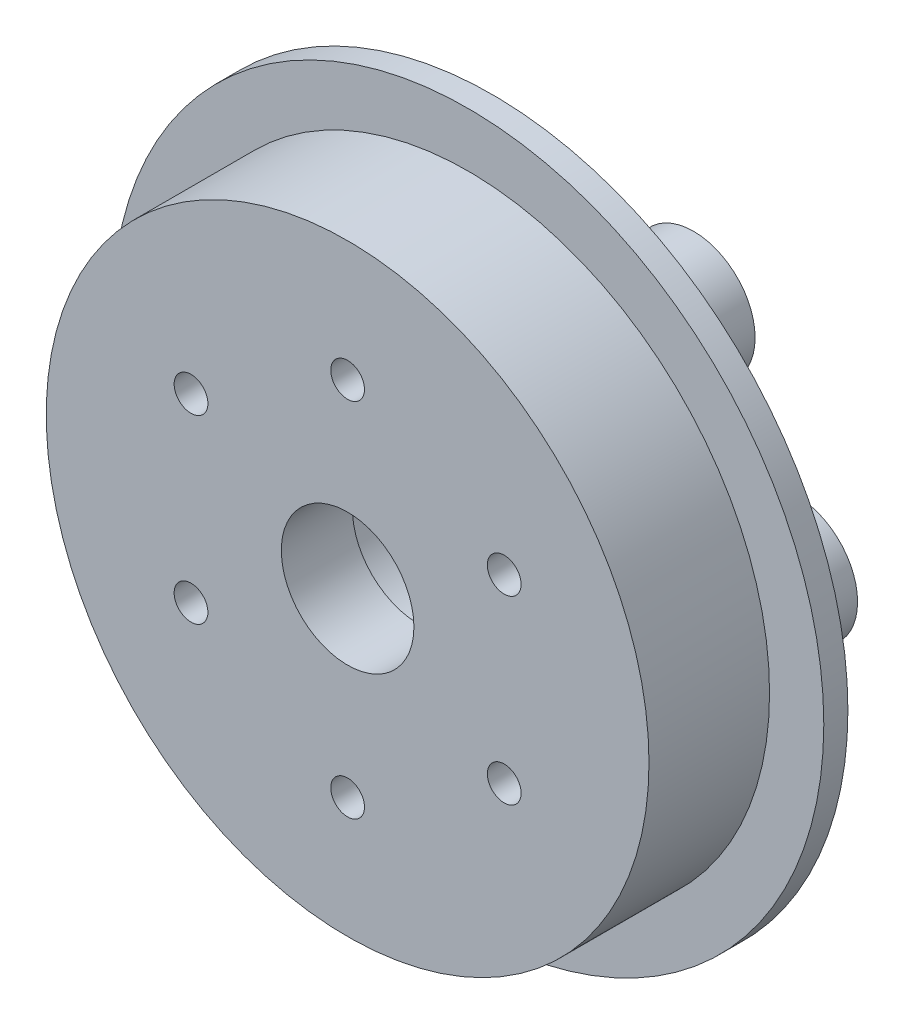
ISO-10303-21;
HEADER;
FILE_DESCRIPTION(('STEP AP214'),'2;1');
FILE_NAME('part.step','',(''),(''),'','','');
FILE_SCHEMA(('AUTOMOTIVE_DESIGN { 1 0 10303 214 1 1 1 1 }'));
ENDSEC;
DATA;
#1=APPLICATION_CONTEXT('core data for automotive mechanical design processes');
#2=APPLICATION_PROTOCOL_DEFINITION('international standard','automotive_design',2000,#1);
#3=PRODUCT_CONTEXT('',#1,'mechanical');
#4=PRODUCT('Part','Part','',(#3));
#5=PRODUCT_RELATED_PRODUCT_CATEGORY('part','',(#4));
#6=PRODUCT_DEFINITION_FORMATION('','',#4);
#7=PRODUCT_DEFINITION_CONTEXT('part definition',#1,'design');
#8=PRODUCT_DEFINITION('design','',#6,#7);
#9=PRODUCT_DEFINITION_SHAPE('','',#8);
#10=(LENGTH_UNIT() NAMED_UNIT(*) SI_UNIT(.MILLI.,.METRE.));
#11=(NAMED_UNIT(*) PLANE_ANGLE_UNIT() SI_UNIT($,.RADIAN.));
#12=(NAMED_UNIT(*) SI_UNIT($,.STERADIAN.) SOLID_ANGLE_UNIT());
#13=UNCERTAINTY_MEASURE_WITH_UNIT(LENGTH_MEASURE(1.E-05),#10,'distance_accuracy_value','');
#14=(GEOMETRIC_REPRESENTATION_CONTEXT(3) GLOBAL_UNCERTAINTY_ASSIGNED_CONTEXT((#13)) GLOBAL_UNIT_ASSIGNED_CONTEXT((#10,
#11,#12)) REPRESENTATION_CONTEXT('',''));
#15=CARTESIAN_POINT('',(0.,0.,0.));
#16=DIRECTION('',(0.,0.,1.));
#17=DIRECTION('',(1.,0.,0.));
#18=AXIS2_PLACEMENT_3D('',#15,#16,#17);
#19=CARTESIAN_POINT('',(0.,0.,12.001));
#20=DIRECTION('',(0.,0.,-1.));
#21=DIRECTION('',(-1.,0.,0.));
#22=AXIS2_PLACEMENT_3D('',#19,#20,#21);
#23=CYLINDRICAL_SURFACE('',#22,6.5);
#24=CARTESIAN_POINT('',(0.,0.,0.));
#25=DIRECTION('',(0.,0.,-1.));
#26=DIRECTION('',(-1.,0.,0.));
#27=AXIS2_PLACEMENT_3D('',#24,#25,#26);
#28=CIRCLE('',#27,6.5);
#29=CARTESIAN_POINT('',(-6.5,0.,0.));
#30=VERTEX_POINT('',#29);
#31=EDGE_CURVE('E98',#30,#30,#28,.T.);
#32=ORIENTED_EDGE('',*,*,#31,.T.);
#33=EDGE_LOOP('',(#32));
#34=FACE_BOUND('',#33,.T.);
#35=CARTESIAN_POINT('',(0.,0.,6.1));
#36=DIRECTION('',(0.,0.,1.));
#37=DIRECTION('',(1.,0.,0.));
#38=AXIS2_PLACEMENT_3D('',#35,#36,#37);
#39=CIRCLE('',#38,6.5);
#40=CARTESIAN_POINT('',(6.5,0.,6.1));
#41=VERTEX_POINT('',#40);
#42=EDGE_CURVE('E10',#41,#41,#39,.F.);
#43=ORIENTED_EDGE('',*,*,#42,.F.);
#44=EDGE_LOOP('',(#43));
#45=FACE_BOUND('',#44,.T.);
#46=ADVANCED_FACE('F34',(#34,#45),#23,.F.);
#47=CARTESIAN_POINT('',(0.,0.,2.));
#48=DIRECTION('',(0.,0.,-1.));
#49=DIRECTION('',(-1.,0.,0.));
#50=AXIS2_PLACEMENT_3D('',#47,#48,#49);
#51=CYLINDRICAL_SURFACE('',#50,29.5);
#52=CARTESIAN_POINT('',(0.,0.,2.));
#53=DIRECTION('',(0.,0.,1.));
#54=DIRECTION('',(1.,0.,0.));
#55=AXIS2_PLACEMENT_3D('',#52,#53,#54);
#56=CIRCLE('',#55,29.5);
#57=CARTESIAN_POINT('',(29.5,0.,2.));
#58=VERTEX_POINT('',#57);
#59=EDGE_CURVE('E67',#58,#58,#56,.T.);
#60=ORIENTED_EDGE('',*,*,#59,.F.);
#61=EDGE_LOOP('',(#60));
#62=FACE_BOUND('',#61,.T.);
#63=CARTESIAN_POINT('',(0.,0.,0.));
#64=DIRECTION('',(0.,0.,1.));
#65=DIRECTION('',(1.,0.,0.));
#66=AXIS2_PLACEMENT_3D('',#63,#64,#65);
#67=CIRCLE('',#66,29.5);
#68=CARTESIAN_POINT('',(29.5,0.,0.));
#69=VERTEX_POINT('',#68);
#70=EDGE_CURVE('E64',#69,#69,#67,.T.);
#71=ORIENTED_EDGE('',*,*,#70,.T.);
#72=EDGE_LOOP('',(#71));
#73=FACE_BOUND('',#72,.T.);
#74=ADVANCED_FACE('F36',(#62,#73),#51,.T.);
#75=CARTESIAN_POINT('',(0.,0.,2.));
#76=DIRECTION('',(0.,0.,1.));
#77=DIRECTION('',(1.,0.,0.));
#78=AXIS2_PLACEMENT_3D('',#75,#76,#77);
#79=PLANE('',#78);
#80=CARTESIAN_POINT('',(0.,0.,2.));
#81=DIRECTION('',(0.,0.,1.));
#82=DIRECTION('',(1.,0.,0.));
#83=AXIS2_PLACEMENT_3D('',#80,#81,#82);
#84=CIRCLE('',#83,25.);
#85=CARTESIAN_POINT('',(25.,0.,2.));
#86=VERTEX_POINT('',#85);
#87=EDGE_CURVE('E63',#86,#86,#84,.T.);
#88=ORIENTED_EDGE('',*,*,#87,.F.);
#89=EDGE_LOOP('',(#88));
#90=FACE_BOUND('',#89,.T.);
#91=ORIENTED_EDGE('',*,*,#59,.T.);
#92=EDGE_LOOP('',(#91));
#93=FACE_BOUND('',#92,.T.);
#94=ADVANCED_FACE('F171',(#90,#93),#79,.T.);
#95=CARTESIAN_POINT('',(0.,0.,0.));
#96=DIRECTION('',(0.,0.,1.));
#97=DIRECTION('',(1.,0.,0.));
#98=AXIS2_PLACEMENT_3D('',#95,#96,#97);
#99=PLANE('',#98);
#100=ORIENTED_EDGE('',*,*,#31,.F.);
#101=EDGE_LOOP('',(#100));
#102=FACE_BOUND('',#101,.T.);
#103=CARTESIAN_POINT('',(1.15185734530882E-12,-15.0000000000007,0.));
#104=DIRECTION('',(0.,0.,1.));
#105=DIRECTION('',(1.,0.,0.));
#106=AXIS2_PLACEMENT_3D('',#103,#104,#105);
#107=CIRCLE('',#106,1.4);
#108=CARTESIAN_POINT('',(1.40000000000115,-15.0000000000007,0.));
#109=VERTEX_POINT('',#108);
#110=EDGE_CURVE('E93',#109,#109,#107,.T.);
#111=ORIENTED_EDGE('',*,*,#110,.T.);
#112=EDGE_LOOP('',(#111));
#113=FACE_BOUND('',#112,.T.);
#114=CARTESIAN_POINT('',(-12.9903810567658,-7.50000000000133,0.));
#115=DIRECTION('',(0.,0.,1.));
#116=DIRECTION('',(1.,0.,0.));
#117=AXIS2_PLACEMENT_3D('',#114,#115,#116);
#118=CIRCLE('',#117,1.4);
#119=CARTESIAN_POINT('',(-11.5903810567658,-7.50000000000133,0.));
#120=VERTEX_POINT('',#119);
#121=EDGE_CURVE('E122',#120,#120,#118,.T.);
#122=ORIENTED_EDGE('',*,*,#121,.T.);
#123=EDGE_LOOP('',(#122));
#124=FACE_BOUND('',#123,.T.);
#125=CARTESIAN_POINT('',(-12.9903810567666,7.49999999999867,0.));
#126=DIRECTION('',(0.,0.,1.));
#127=DIRECTION('',(1.,0.,0.));
#128=AXIS2_PLACEMENT_3D('',#125,#126,#127);
#129=CIRCLE('',#128,1.4);
#130=CARTESIAN_POINT('',(-11.5903810567666,7.49999999999867,0.));
#131=VERTEX_POINT('',#130);
#132=EDGE_CURVE('E116',#131,#131,#129,.T.);
#133=ORIENTED_EDGE('',*,*,#132,.T.);
#134=EDGE_LOOP('',(#133));
#135=FACE_BOUND('',#134,.T.);
#136=CARTESIAN_POINT('',(12.9903810567673,-7.49999999999998,0.));
#137=DIRECTION('',(0.,0.,1.));
#138=DIRECTION('',(1.,0.,0.));
#139=AXIS2_PLACEMENT_3D('',#136,#137,#138);
#140=CIRCLE('',#139,1.4);
#141=CARTESIAN_POINT('',(14.3903810567673,-7.49999999999998,0.));
#142=VERTEX_POINT('',#141);
#143=EDGE_CURVE('E110',#142,#142,#140,.T.);
#144=ORIENTED_EDGE('',*,*,#143,.T.);
#145=EDGE_LOOP('',(#144));
#146=FACE_BOUND('',#145,.T.);
#147=CARTESIAN_POINT('',(12.9903810567666,7.50000000000002,0.));
#148=DIRECTION('',(0.,0.,1.));
#149=DIRECTION('',(1.,0.,0.));
#150=AXIS2_PLACEMENT_3D('',#147,#148,#149);
#151=CIRCLE('',#150,1.4);
#152=CARTESIAN_POINT('',(14.3903810567666,7.50000000000002,0.));
#153=VERTEX_POINT('',#152);
#154=EDGE_CURVE('E104',#153,#153,#151,.T.);
#155=ORIENTED_EDGE('',*,*,#154,.T.);
#156=EDGE_LOOP('',(#155));
#157=FACE_BOUND('',#156,.T.);
#158=CARTESIAN_POINT('',(-4.11130421066727E-13,14.9999999999993,0.));
#159=DIRECTION('',(0.,0.,1.));
#160=DIRECTION('',(1.,0.,0.));
#161=AXIS2_PLACEMENT_3D('',#158,#159,#160);
#162=CIRCLE('',#161,1.4);
#163=CARTESIAN_POINT('',(1.39999999999959,14.9999999999993,0.));
#164=VERTEX_POINT('',#163);
#165=EDGE_CURVE('E97',#164,#164,#162,.T.);
#166=ORIENTED_EDGE('',*,*,#165,.T.);
#167=EDGE_LOOP('',(#166));
#168=FACE_BOUND('',#167,.T.);
#169=CARTESIAN_POINT('',(-8.49999999999997,-14.7224318643355,0.));
#170=DIRECTION('',(0.,0.,1.));
#171=DIRECTION('',(1.,0.,0.));
#172=AXIS2_PLACEMENT_3D('',#169,#170,#171);
#173=CIRCLE('',#172,5.1);
#174=CARTESIAN_POINT('',(-3.39999999999996,-14.7224318643355,0.));
#175=VERTEX_POINT('',#174);
#176=EDGE_CURVE('E41',#175,#175,#173,.F.);
#177=ORIENTED_EDGE('',*,*,#176,.F.);
#178=EDGE_LOOP('',(#177));
#179=FACE_BOUND('',#178,.T.);
#180=CARTESIAN_POINT('',(8.50000000000007,-14.7224318643354,0.));
#181=DIRECTION('',(0.,0.,1.));
#182=DIRECTION('',(1.,0.,0.));
#183=AXIS2_PLACEMENT_3D('',#180,#181,#182);
#184=CIRCLE('',#183,5.1);
#185=CARTESIAN_POINT('',(13.6000000000001,-14.7224318643354,0.));
#186=VERTEX_POINT('',#185);
#187=EDGE_CURVE('E45',#186,#186,#184,.F.);
#188=ORIENTED_EDGE('',*,*,#187,.F.);
#189=EDGE_LOOP('',(#188));
#190=FACE_BOUND('',#189,.T.);
#191=CARTESIAN_POINT('',(17.,1.18710365520667E-13,0.));
#192=DIRECTION('',(0.,0.,1.));
#193=DIRECTION('',(1.,0.,0.));
#194=AXIS2_PLACEMENT_3D('',#191,#192,#193);
#195=CIRCLE('',#194,5.1);
#196=CARTESIAN_POINT('',(22.1,1.18710365520667E-13,0.));
#197=VERTEX_POINT('',#196);
#198=EDGE_CURVE('E49',#197,#197,#195,.F.);
#199=ORIENTED_EDGE('',*,*,#198,.F.);
#200=EDGE_LOOP('',(#199));
#201=FACE_BOUND('',#200,.T.);
#202=CARTESIAN_POINT('',(8.49999999999986,14.7224318643355,0.));
#203=DIRECTION('',(0.,0.,1.));
#204=DIRECTION('',(1.,0.,0.));
#205=AXIS2_PLACEMENT_3D('',#202,#203,#204);
#206=CIRCLE('',#205,5.1);
#207=CARTESIAN_POINT('',(13.5999999999999,14.7224318643355,0.));
#208=VERTEX_POINT('',#207);
#209=EDGE_CURVE('E54',#208,#208,#206,.F.);
#210=ORIENTED_EDGE('',*,*,#209,.F.);
#211=EDGE_LOOP('',(#210));
#212=FACE_BOUND('',#211,.T.);
#213=CARTESIAN_POINT('',(-8.50000000000017,14.7224318643354,0.));
#214=DIRECTION('',(0.,0.,1.));
#215=DIRECTION('',(1.,0.,0.));
#216=AXIS2_PLACEMENT_3D('',#213,#214,#215);
#217=CIRCLE('',#216,5.1);
#218=CARTESIAN_POINT('',(-3.40000000000017,14.7224318643354,0.));
#219=VERTEX_POINT('',#218);
#220=EDGE_CURVE('E57',#219,#219,#217,.F.);
#221=ORIENTED_EDGE('',*,*,#220,.F.);
#222=EDGE_LOOP('',(#221));
#223=FACE_BOUND('',#222,.T.);
#224=CARTESIAN_POINT('',(-17.,0.,0.));
#225=DIRECTION('',(0.,0.,1.));
#226=DIRECTION('',(1.,0.,0.));
#227=AXIS2_PLACEMENT_3D('',#224,#225,#226);
#228=CIRCLE('',#227,5.1);
#229=CARTESIAN_POINT('',(-11.9,0.,0.));
#230=VERTEX_POINT('',#229);
#231=EDGE_CURVE('E60',#230,#230,#228,.F.);
#232=ORIENTED_EDGE('',*,*,#231,.F.);
#233=EDGE_LOOP('',(#232));
#234=FACE_BOUND('',#233,.T.);
#235=ORIENTED_EDGE('',*,*,#70,.F.);
#236=EDGE_LOOP('',(#235));
#237=FACE_BOUND('',#236,.T.);
#238=ADVANCED_FACE('F160',(#102,#113,#124,#135,#146,#157,#168,#179,#190,#201,#212,#223,#234,
#237),#99,.F.);
#239=CARTESIAN_POINT('',(0.,0.,12.));
#240=DIRECTION('',(0.,0.,-1.));
#241=DIRECTION('',(-1.,0.,0.));
#242=AXIS2_PLACEMENT_3D('',#239,#240,#241);
#243=CYLINDRICAL_SURFACE('',#242,25.);
#244=CARTESIAN_POINT('',(0.,0.,12.));
#245=DIRECTION('',(0.,0.,1.));
#246=DIRECTION('',(1.,0.,0.));
#247=AXIS2_PLACEMENT_3D('',#244,#245,#246);
#248=CIRCLE('',#247,25.);
#249=CARTESIAN_POINT('',(25.,0.,12.));
#250=VERTEX_POINT('',#249);
#251=EDGE_CURVE('E68',#250,#250,#248,.T.);
#252=ORIENTED_EDGE('',*,*,#251,.F.);
#253=EDGE_LOOP('',(#252));
#254=FACE_BOUND('',#253,.T.);
#255=ORIENTED_EDGE('',*,*,#87,.T.);
#256=EDGE_LOOP('',(#255));
#257=FACE_BOUND('',#256,.T.);
#258=ADVANCED_FACE('F150',(#254,#257),#243,.T.);
#259=CARTESIAN_POINT('',(0.,0.,12.));
#260=DIRECTION('',(0.,0.,1.));
#261=DIRECTION('',(1.,0.,0.));
#262=AXIS2_PLACEMENT_3D('',#259,#260,#261);
#263=PLANE('',#262);
#264=CARTESIAN_POINT('',(1.15185734530882E-12,-15.0000000000007,12.));
#265=DIRECTION('',(0.,0.,1.));
#266=DIRECTION('',(1.,0.,0.));
#267=AXIS2_PLACEMENT_3D('',#264,#265,#266);
#268=CIRCLE('',#267,1.4);
#269=CARTESIAN_POINT('',(1.40000000000115,-15.0000000000007,12.));
#270=VERTEX_POINT('',#269);
#271=EDGE_CURVE('E125',#270,#270,#268,.T.);
#272=ORIENTED_EDGE('',*,*,#271,.F.);
#273=EDGE_LOOP('',(#272));
#274=FACE_BOUND('',#273,.T.);
#275=CARTESIAN_POINT('',(-12.9903810567658,-7.50000000000133,12.));
#276=DIRECTION('',(0.,0.,1.));
#277=DIRECTION('',(1.,0.,0.));
#278=AXIS2_PLACEMENT_3D('',#275,#276,#277);
#279=CIRCLE('',#278,1.4);
#280=CARTESIAN_POINT('',(-11.5903810567658,-7.50000000000133,12.));
#281=VERTEX_POINT('',#280);
#282=EDGE_CURVE('E119',#281,#281,#279,.T.);
#283=ORIENTED_EDGE('',*,*,#282,.F.);
#284=EDGE_LOOP('',(#283));
#285=FACE_BOUND('',#284,.T.);
#286=CARTESIAN_POINT('',(-12.9903810567666,7.49999999999867,12.));
#287=DIRECTION('',(0.,0.,1.));
#288=DIRECTION('',(1.,0.,0.));
#289=AXIS2_PLACEMENT_3D('',#286,#287,#288);
#290=CIRCLE('',#289,1.4);
#291=CARTESIAN_POINT('',(-11.5903810567666,7.49999999999867,12.));
#292=VERTEX_POINT('',#291);
#293=EDGE_CURVE('E113',#292,#292,#290,.T.);
#294=ORIENTED_EDGE('',*,*,#293,.F.);
#295=EDGE_LOOP('',(#294));
#296=FACE_BOUND('',#295,.T.);
#297=CARTESIAN_POINT('',(12.9903810567673,-7.49999999999998,12.));
#298=DIRECTION('',(0.,0.,1.));
#299=DIRECTION('',(1.,0.,0.));
#300=AXIS2_PLACEMENT_3D('',#297,#298,#299);
#301=CIRCLE('',#300,1.4);
#302=CARTESIAN_POINT('',(14.3903810567673,-7.49999999999998,12.));
#303=VERTEX_POINT('',#302);
#304=EDGE_CURVE('E107',#303,#303,#301,.T.);
#305=ORIENTED_EDGE('',*,*,#304,.F.);
#306=EDGE_LOOP('',(#305));
#307=FACE_BOUND('',#306,.T.);
#308=CARTESIAN_POINT('',(12.9903810567666,7.50000000000002,12.));
#309=DIRECTION('',(0.,0.,1.));
#310=DIRECTION('',(1.,0.,0.));
#311=AXIS2_PLACEMENT_3D('',#308,#309,#310);
#312=CIRCLE('',#311,1.4);
#313=CARTESIAN_POINT('',(14.3903810567666,7.50000000000002,12.));
#314=VERTEX_POINT('',#313);
#315=EDGE_CURVE('E101',#314,#314,#312,.T.);
#316=ORIENTED_EDGE('',*,*,#315,.F.);
#317=EDGE_LOOP('',(#316));
#318=FACE_BOUND('',#317,.T.);
#319=CARTESIAN_POINT('',(-4.11130421066727E-13,14.9999999999993,12.));
#320=DIRECTION('',(0.,0.,1.));
#321=DIRECTION('',(1.,0.,0.));
#322=AXIS2_PLACEMENT_3D('',#319,#320,#321);
#323=CIRCLE('',#322,1.4);
#324=CARTESIAN_POINT('',(1.39999999999959,14.9999999999993,12.));
#325=VERTEX_POINT('',#324);
#326=EDGE_CURVE('E94',#325,#325,#323,.T.);
#327=ORIENTED_EDGE('',*,*,#326,.F.);
#328=EDGE_LOOP('',(#327));
#329=FACE_BOUND('',#328,.T.);
#330=ORIENTED_EDGE('',*,*,#251,.T.);
#331=EDGE_LOOP('',(#330));
#332=FACE_BOUND('',#331,.T.);
#333=CARTESIAN_POINT('',(0.,0.,12.));
#334=DIRECTION('',(0.,0.,1.));
#335=DIRECTION('',(1.,0.,0.));
#336=AXIS2_PLACEMENT_3D('',#333,#334,#335);
#337=CIRCLE('',#336,5.5);
#338=CARTESIAN_POINT('',(5.5,0.,12.));
#339=VERTEX_POINT('',#338);
#340=EDGE_CURVE('E133',#339,#339,#337,.T.);
#341=ORIENTED_EDGE('',*,*,#340,.F.);
#342=EDGE_LOOP('',(#341));
#343=FACE_BOUND('',#342,.T.);
#344=ADVANCED_FACE('F147',(#274,#285,#296,#307,#318,#329,#332,#343),#263,.T.);
#345=CARTESIAN_POINT('',(-17.,0.,-8.2));
#346=DIRECTION('',(0.,0.,1.));
#347=DIRECTION('',(1.,0.,0.));
#348=AXIS2_PLACEMENT_3D('',#345,#346,#347);
#349=CYLINDRICAL_SURFACE('',#348,5.1);
#350=CARTESIAN_POINT('',(-17.,0.,-8.2));
#351=DIRECTION('',(0.,0.,-1.));
#352=DIRECTION('',(-1.,0.,0.));
#353=AXIS2_PLACEMENT_3D('',#350,#351,#352);
#354=CIRCLE('',#353,5.1);
#355=CARTESIAN_POINT('',(-22.1,0.,-8.2));
#356=VERTEX_POINT('',#355);
#357=EDGE_CURVE('E75',#356,#356,#354,.T.);
#358=ORIENTED_EDGE('',*,*,#357,.F.);
#359=EDGE_LOOP('',(#358));
#360=FACE_BOUND('',#359,.T.);
#361=ORIENTED_EDGE('',*,*,#231,.T.);
#362=EDGE_LOOP('',(#361));
#363=FACE_BOUND('',#362,.T.);
#364=ADVANCED_FACE('F149',(#360,#363),#349,.T.);
#365=CARTESIAN_POINT('',(0.,0.,-8.2));
#366=DIRECTION('',(0.,0.,-1.));
#367=DIRECTION('',(-1.,0.,0.));
#368=AXIS2_PLACEMENT_3D('',#365,#366,#367);
#369=PLANE('',#368);
#370=ORIENTED_EDGE('',*,*,#357,.T.);
#371=EDGE_LOOP('',(#370));
#372=FACE_BOUND('',#371,.T.);
#373=ADVANCED_FACE('F157',(#372),#369,.T.);
#374=CARTESIAN_POINT('',(-8.50000000000017,14.7224318643354,-8.2));
#375=DIRECTION('',(0.,0.,1.));
#376=DIRECTION('',(1.,0.,0.));
#377=AXIS2_PLACEMENT_3D('',#374,#375,#376);
#378=CYLINDRICAL_SURFACE('',#377,5.1);
#379=CARTESIAN_POINT('',(-8.50000000000017,14.7224318643354,-8.2));
#380=DIRECTION('',(0.,0.,-1.));
#381=DIRECTION('',(-1.,0.,0.));
#382=AXIS2_PLACEMENT_3D('',#379,#380,#381);
#383=CIRCLE('',#382,5.1);
#384=CARTESIAN_POINT('',(-13.6000000000002,14.7224318643354,-8.2));
#385=VERTEX_POINT('',#384);
#386=EDGE_CURVE('E78',#385,#385,#383,.T.);
#387=ORIENTED_EDGE('',*,*,#386,.F.);
#388=EDGE_LOOP('',(#387));
#389=FACE_BOUND('',#388,.T.);
#390=ORIENTED_EDGE('',*,*,#220,.T.);
#391=EDGE_LOOP('',(#390));
#392=FACE_BOUND('',#391,.T.);
#393=ADVANCED_FACE('F235',(#389,#392),#378,.T.);
#394=CARTESIAN_POINT('',(0.,0.,-8.2));
#395=DIRECTION('',(0.,0.,-1.));
#396=DIRECTION('',(-1.,0.,0.));
#397=AXIS2_PLACEMENT_3D('',#394,#395,#396);
#398=PLANE('',#397);
#399=ORIENTED_EDGE('',*,*,#386,.T.);
#400=EDGE_LOOP('',(#399));
#401=FACE_BOUND('',#400,.T.);
#402=ADVANCED_FACE('F231',(#401),#398,.T.);
#403=CARTESIAN_POINT('',(8.49999999999986,14.7224318643355,-8.2));
#404=DIRECTION('',(0.,0.,1.));
#405=DIRECTION('',(1.,0.,0.));
#406=AXIS2_PLACEMENT_3D('',#403,#404,#405);
#407=CYLINDRICAL_SURFACE('',#406,5.1);
#408=CARTESIAN_POINT('',(8.49999999999986,14.7224318643355,-8.2));
#409=DIRECTION('',(0.,0.,-1.));
#410=DIRECTION('',(-1.,0.,0.));
#411=AXIS2_PLACEMENT_3D('',#408,#409,#410);
#412=CIRCLE('',#411,5.1);
#413=CARTESIAN_POINT('',(3.39999999999986,14.7224318643355,-8.2));
#414=VERTEX_POINT('',#413);
#415=EDGE_CURVE('E81',#414,#414,#412,.T.);
#416=ORIENTED_EDGE('',*,*,#415,.F.);
#417=EDGE_LOOP('',(#416));
#418=FACE_BOUND('',#417,.T.);
#419=ORIENTED_EDGE('',*,*,#209,.T.);
#420=EDGE_LOOP('',(#419));
#421=FACE_BOUND('',#420,.T.);
#422=ADVANCED_FACE('F227',(#418,#421),#407,.T.);
#423=CARTESIAN_POINT('',(0.,0.,-8.2));
#424=DIRECTION('',(0.,0.,-1.));
#425=DIRECTION('',(-1.,0.,0.));
#426=AXIS2_PLACEMENT_3D('',#423,#424,#425);
#427=PLANE('',#426);
#428=ORIENTED_EDGE('',*,*,#415,.T.);
#429=EDGE_LOOP('',(#428));
#430=FACE_BOUND('',#429,.T.);
#431=ADVANCED_FACE('F223',(#430),#427,.T.);
#432=CARTESIAN_POINT('',(17.,1.18710365520667E-13,-8.2));
#433=DIRECTION('',(0.,0.,1.));
#434=DIRECTION('',(1.,0.,0.));
#435=AXIS2_PLACEMENT_3D('',#432,#433,#434);
#436=CYLINDRICAL_SURFACE('',#435,5.1);
#437=CARTESIAN_POINT('',(17.,1.18710365520667E-13,-8.2));
#438=DIRECTION('',(0.,0.,-1.));
#439=DIRECTION('',(-1.,0.,0.));
#440=AXIS2_PLACEMENT_3D('',#437,#438,#439);
#441=CIRCLE('',#440,5.1);
#442=CARTESIAN_POINT('',(11.9,1.18710365520667E-13,-8.2));
#443=VERTEX_POINT('',#442);
#444=EDGE_CURVE('E84',#443,#443,#441,.T.);
#445=ORIENTED_EDGE('',*,*,#444,.F.);
#446=EDGE_LOOP('',(#445));
#447=FACE_BOUND('',#446,.T.);
#448=ORIENTED_EDGE('',*,*,#198,.T.);
#449=EDGE_LOOP('',(#448));
#450=FACE_BOUND('',#449,.T.);
#451=ADVANCED_FACE('F219',(#447,#450),#436,.T.);
#452=CARTESIAN_POINT('',(0.,0.,-8.2));
#453=DIRECTION('',(0.,0.,-1.));
#454=DIRECTION('',(-1.,0.,0.));
#455=AXIS2_PLACEMENT_3D('',#452,#453,#454);
#456=PLANE('',#455);
#457=ORIENTED_EDGE('',*,*,#444,.T.);
#458=EDGE_LOOP('',(#457));
#459=FACE_BOUND('',#458,.T.);
#460=ADVANCED_FACE('F215',(#459),#456,.T.);
#461=CARTESIAN_POINT('',(8.50000000000007,-14.7224318643354,-8.2));
#462=DIRECTION('',(0.,0.,1.));
#463=DIRECTION('',(1.,0.,0.));
#464=AXIS2_PLACEMENT_3D('',#461,#462,#463);
#465=CYLINDRICAL_SURFACE('',#464,5.1);
#466=CARTESIAN_POINT('',(8.50000000000007,-14.7224318643354,-8.2));
#467=DIRECTION('',(0.,0.,-1.));
#468=DIRECTION('',(-1.,0.,0.));
#469=AXIS2_PLACEMENT_3D('',#466,#467,#468);
#470=CIRCLE('',#469,5.1);
#471=CARTESIAN_POINT('',(3.40000000000007,-14.7224318643354,-8.2));
#472=VERTEX_POINT('',#471);
#473=EDGE_CURVE('E87',#472,#472,#470,.T.);
#474=ORIENTED_EDGE('',*,*,#473,.F.);
#475=EDGE_LOOP('',(#474));
#476=FACE_BOUND('',#475,.T.);
#477=ORIENTED_EDGE('',*,*,#187,.T.);
#478=EDGE_LOOP('',(#477));
#479=FACE_BOUND('',#478,.T.);
#480=ADVANCED_FACE('F211',(#476,#479),#465,.T.);
#481=CARTESIAN_POINT('',(0.,0.,-8.2));
#482=DIRECTION('',(0.,0.,-1.));
#483=DIRECTION('',(-1.,0.,0.));
#484=AXIS2_PLACEMENT_3D('',#481,#482,#483);
#485=PLANE('',#484);
#486=ORIENTED_EDGE('',*,*,#473,.T.);
#487=EDGE_LOOP('',(#486));
#488=FACE_BOUND('',#487,.T.);
#489=ADVANCED_FACE('F207',(#488),#485,.T.);
#490=CARTESIAN_POINT('',(-8.49999999999997,-14.7224318643355,-8.2));
#491=DIRECTION('',(0.,0.,1.));
#492=DIRECTION('',(1.,0.,0.));
#493=AXIS2_PLACEMENT_3D('',#490,#491,#492);
#494=CYLINDRICAL_SURFACE('',#493,5.1);
#495=CARTESIAN_POINT('',(-8.49999999999997,-14.7224318643355,-8.2));
#496=DIRECTION('',(0.,0.,-1.));
#497=DIRECTION('',(-1.,0.,0.));
#498=AXIS2_PLACEMENT_3D('',#495,#496,#497);
#499=CIRCLE('',#498,5.1);
#500=CARTESIAN_POINT('',(-13.6,-14.7224318643355,-8.2));
#501=VERTEX_POINT('',#500);
#502=EDGE_CURVE('E90',#501,#501,#499,.T.);
#503=ORIENTED_EDGE('',*,*,#502,.F.);
#504=EDGE_LOOP('',(#503));
#505=FACE_BOUND('',#504,.T.);
#506=ORIENTED_EDGE('',*,*,#176,.T.);
#507=EDGE_LOOP('',(#506));
#508=FACE_BOUND('',#507,.T.);
#509=ADVANCED_FACE('F203',(#505,#508),#494,.T.);
#510=CARTESIAN_POINT('',(0.,0.,-8.2));
#511=DIRECTION('',(0.,0.,-1.));
#512=DIRECTION('',(-1.,0.,0.));
#513=AXIS2_PLACEMENT_3D('',#510,#511,#512);
#514=PLANE('',#513);
#515=ORIENTED_EDGE('',*,*,#502,.T.);
#516=EDGE_LOOP('',(#515));
#517=FACE_BOUND('',#516,.T.);
#518=ADVANCED_FACE('F199',(#517),#514,.T.);
#519=CARTESIAN_POINT('',(-4.11130421066727E-13,14.9999999999993,0.));
#520=DIRECTION('',(0.,0.,1.));
#521=DIRECTION('',(1.,0.,0.));
#522=AXIS2_PLACEMENT_3D('',#519,#520,#521);
#523=CYLINDRICAL_SURFACE('',#522,1.4);
#524=ORIENTED_EDGE('',*,*,#165,.F.);
#525=EDGE_LOOP('',(#524));
#526=FACE_BOUND('',#525,.T.);
#527=ORIENTED_EDGE('',*,*,#326,.T.);
#528=EDGE_LOOP('',(#527));
#529=FACE_BOUND('',#528,.T.);
#530=ADVANCED_FACE('F195',(#526,#529),#523,.F.);
#531=CARTESIAN_POINT('',(12.9903810567666,7.50000000000002,0.));
#532=DIRECTION('',(0.,0.,1.));
#533=DIRECTION('',(1.,0.,0.));
#534=AXIS2_PLACEMENT_3D('',#531,#532,#533);
#535=CYLINDRICAL_SURFACE('',#534,1.4);
#536=ORIENTED_EDGE('',*,*,#154,.F.);
#537=EDGE_LOOP('',(#536));
#538=FACE_BOUND('',#537,.T.);
#539=ORIENTED_EDGE('',*,*,#315,.T.);
#540=EDGE_LOOP('',(#539));
#541=FACE_BOUND('',#540,.T.);
#542=ADVANCED_FACE('F191',(#538,#541),#535,.F.);
#543=CARTESIAN_POINT('',(12.9903810567673,-7.49999999999998,0.));
#544=DIRECTION('',(0.,0.,1.));
#545=DIRECTION('',(1.,0.,0.));
#546=AXIS2_PLACEMENT_3D('',#543,#544,#545);
#547=CYLINDRICAL_SURFACE('',#546,1.4);
#548=ORIENTED_EDGE('',*,*,#143,.F.);
#549=EDGE_LOOP('',(#548));
#550=FACE_BOUND('',#549,.T.);
#551=ORIENTED_EDGE('',*,*,#304,.T.);
#552=EDGE_LOOP('',(#551));
#553=FACE_BOUND('',#552,.T.);
#554=ADVANCED_FACE('F187',(#550,#553),#547,.F.);
#555=CARTESIAN_POINT('',(-12.9903810567666,7.49999999999867,0.));
#556=DIRECTION('',(0.,0.,1.));
#557=DIRECTION('',(1.,0.,0.));
#558=AXIS2_PLACEMENT_3D('',#555,#556,#557);
#559=CYLINDRICAL_SURFACE('',#558,1.4);
#560=ORIENTED_EDGE('',*,*,#132,.F.);
#561=EDGE_LOOP('',(#560));
#562=FACE_BOUND('',#561,.T.);
#563=ORIENTED_EDGE('',*,*,#293,.T.);
#564=EDGE_LOOP('',(#563));
#565=FACE_BOUND('',#564,.T.);
#566=ADVANCED_FACE('F183',(#562,#565),#559,.F.);
#567=CARTESIAN_POINT('',(-12.9903810567658,-7.50000000000133,0.));
#568=DIRECTION('',(0.,0.,1.));
#569=DIRECTION('',(1.,0.,0.));
#570=AXIS2_PLACEMENT_3D('',#567,#568,#569);
#571=CYLINDRICAL_SURFACE('',#570,1.4);
#572=ORIENTED_EDGE('',*,*,#121,.F.);
#573=EDGE_LOOP('',(#572));
#574=FACE_BOUND('',#573,.T.);
#575=ORIENTED_EDGE('',*,*,#282,.T.);
#576=EDGE_LOOP('',(#575));
#577=FACE_BOUND('',#576,.T.);
#578=ADVANCED_FACE('F179',(#574,#577),#571,.F.);
#579=CARTESIAN_POINT('',(1.15185734530882E-12,-15.0000000000007,0.));
#580=DIRECTION('',(0.,0.,1.));
#581=DIRECTION('',(1.,0.,0.));
#582=AXIS2_PLACEMENT_3D('',#579,#580,#581);
#583=CYLINDRICAL_SURFACE('',#582,1.4);
#584=ORIENTED_EDGE('',*,*,#110,.F.);
#585=EDGE_LOOP('',(#584));
#586=FACE_BOUND('',#585,.T.);
#587=ORIENTED_EDGE('',*,*,#271,.T.);
#588=EDGE_LOOP('',(#587));
#589=FACE_BOUND('',#588,.T.);
#590=ADVANCED_FACE('F176',(#586,#589),#583,.F.);
#591=CARTESIAN_POINT('',(0.,0.,6.1));
#592=DIRECTION('',(0.,0.,1.));
#593=DIRECTION('',(1.,0.,0.));
#594=AXIS2_PLACEMENT_3D('',#591,#592,#593);
#595=PLANE('',#594);
#596=CARTESIAN_POINT('',(0.,0.,6.1));
#597=DIRECTION('',(0.,0.,1.));
#598=DIRECTION('',(1.,0.,0.));
#599=AXIS2_PLACEMENT_3D('',#596,#597,#598);
#600=CIRCLE('',#599,5.5);
#601=CARTESIAN_POINT('',(5.5,0.,6.1));
#602=VERTEX_POINT('',#601);
#603=EDGE_CURVE('E132',#602,#602,#600,.T.);
#604=ORIENTED_EDGE('',*,*,#603,.T.);
#605=EDGE_LOOP('',(#604));
#606=FACE_BOUND('',#605,.T.);
#607=ORIENTED_EDGE('',*,*,#42,.T.);
#608=EDGE_LOOP('',(#607));
#609=FACE_BOUND('',#608,.T.);
#610=ADVANCED_FACE('F139',(#606,#609),#595,.F.);
#611=CARTESIAN_POINT('',(0.,0.,6.1));
#612=DIRECTION('',(0.,0.,1.));
#613=DIRECTION('',(1.,0.,0.));
#614=AXIS2_PLACEMENT_3D('',#611,#612,#613);
#615=CYLINDRICAL_SURFACE('',#614,5.5);
#616=ORIENTED_EDGE('',*,*,#603,.F.);
#617=EDGE_LOOP('',(#616));
#618=FACE_BOUND('',#617,.T.);
#619=ORIENTED_EDGE('',*,*,#340,.T.);
#620=EDGE_LOOP('',(#619));
#621=FACE_BOUND('',#620,.T.);
#622=ADVANCED_FACE('F141',(#618,#621),#615,.F.);
#623=CLOSED_SHELL('',(#46,#74,#94,#238,#258,#344,#364,#373,#393,#402,#422,#431,#451,#460,#480,
#489,#509,#518,#530,#542,#554,#566,#578,#590,#610,#622));
#624=MANIFOLD_SOLID_BREP('B2',#623);
#625=ADVANCED_BREP_SHAPE_REPRESENTATION('',(#18,#624),#14);
#626=SHAPE_DEFINITION_REPRESENTATION(#9,#625);
ENDSEC;
END-ISO-10303-21;
